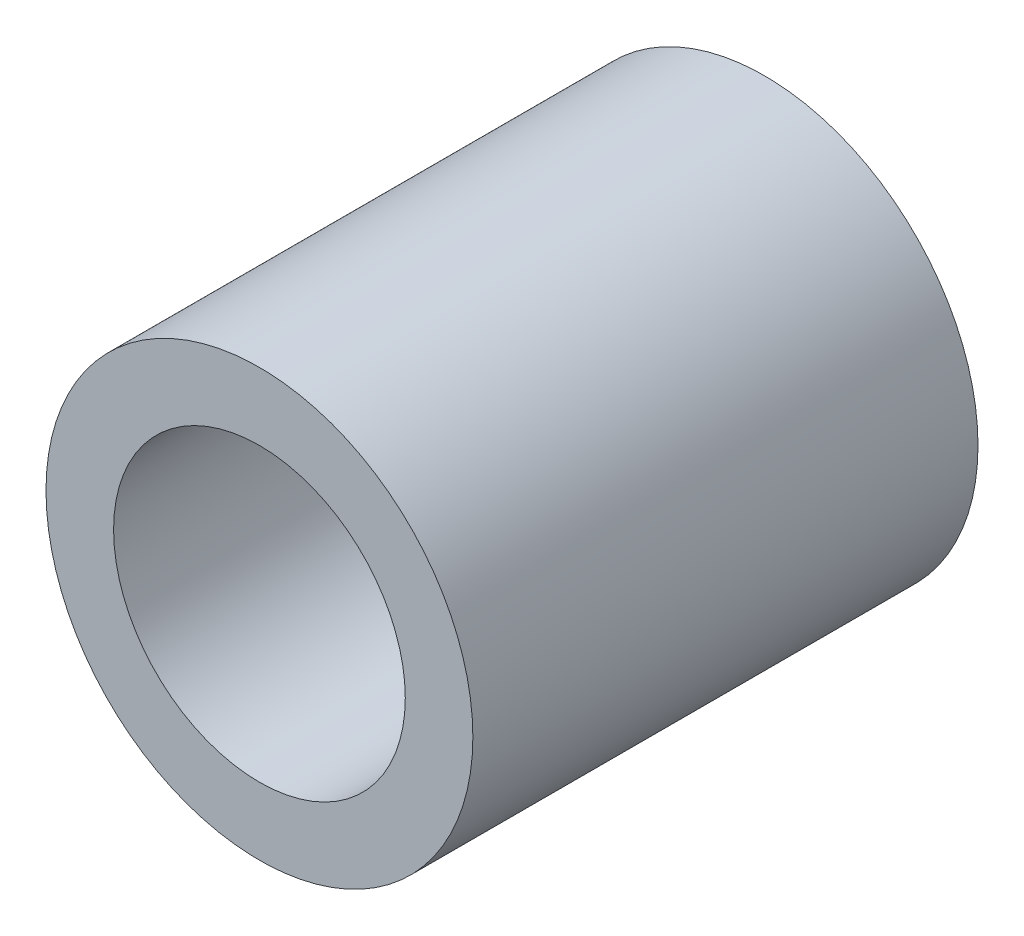
ISO-10303-21;
HEADER;
FILE_DESCRIPTION(('STEP AP214'),'2;1');
FILE_NAME('part.step','',(''),(''),'','','');
FILE_SCHEMA(('AUTOMOTIVE_DESIGN { 1 0 10303 214 1 1 1 1 }'));
ENDSEC;
DATA;
#1=APPLICATION_CONTEXT('core data for automotive mechanical design processes');
#2=APPLICATION_PROTOCOL_DEFINITION('international standard','automotive_design',2000,#1);
#3=PRODUCT_CONTEXT('',#1,'mechanical');
#4=PRODUCT('Part','Part','',(#3));
#5=PRODUCT_RELATED_PRODUCT_CATEGORY('part','',(#4));
#6=PRODUCT_DEFINITION_FORMATION('','',#4);
#7=PRODUCT_DEFINITION_CONTEXT('part definition',#1,'design');
#8=PRODUCT_DEFINITION('design','',#6,#7);
#9=PRODUCT_DEFINITION_SHAPE('','',#8);
#10=(LENGTH_UNIT() NAMED_UNIT(*) SI_UNIT(.MILLI.,.METRE.));
#11=(NAMED_UNIT(*) PLANE_ANGLE_UNIT() SI_UNIT($,.RADIAN.));
#12=(NAMED_UNIT(*) SI_UNIT($,.STERADIAN.) SOLID_ANGLE_UNIT());
#13=UNCERTAINTY_MEASURE_WITH_UNIT(LENGTH_MEASURE(1.E-05),#10,'distance_accuracy_value','');
#14=(GEOMETRIC_REPRESENTATION_CONTEXT(3) GLOBAL_UNCERTAINTY_ASSIGNED_CONTEXT((#13)) GLOBAL_UNIT_ASSIGNED_CONTEXT((#10,
#11,#12)) REPRESENTATION_CONTEXT('',''));
#15=CARTESIAN_POINT('',(0.,0.,0.));
#16=DIRECTION('',(0.,0.,1.));
#17=DIRECTION('',(1.,0.,0.));
#18=AXIS2_PLACEMENT_3D('',#15,#16,#17);
#19=CARTESIAN_POINT('',(0.,0.,7.1));
#20=DIRECTION('',(0.,0.,1.));
#21=DIRECTION('',(1.,0.,0.));
#22=AXIS2_PLACEMENT_3D('',#19,#20,#21);
#23=PLANE('',#22);
#24=CARTESIAN_POINT('',(0.,0.,7.1));
#25=DIRECTION('',(0.,0.,1.));
#26=DIRECTION('',(1.,0.,0.));
#27=AXIS2_PLACEMENT_3D('',#24,#25,#26);
#28=CIRCLE('',#27,3.);
#29=CARTESIAN_POINT('',(3.,0.,7.1));
#30=VERTEX_POINT('',#29);
#31=EDGE_CURVE('E10',#30,#30,#28,.T.);
#32=ORIENTED_EDGE('',*,*,#31,.T.);
#33=EDGE_LOOP('',(#32));
#34=FACE_BOUND('',#33,.T.);
#35=CARTESIAN_POINT('',(0.,0.,7.1));
#36=DIRECTION('',(0.,0.,1.));
#37=DIRECTION('',(1.,0.,0.));
#38=AXIS2_PLACEMENT_3D('',#35,#36,#37);
#39=CIRCLE('',#38,2.05);
#40=CARTESIAN_POINT('',(2.05,0.,7.1));
#41=VERTEX_POINT('',#40);
#42=EDGE_CURVE('E41',#41,#41,#39,.T.);
#43=ORIENTED_EDGE('',*,*,#42,.F.);
#44=EDGE_LOOP('',(#43));
#45=FACE_BOUND('',#44,.T.);
#46=ADVANCED_FACE('F30',(#34,#45),#23,.T.);
#47=CARTESIAN_POINT('',(0.,0.,0.));
#48=DIRECTION('',(0.,0.,1.));
#49=DIRECTION('',(1.,0.,0.));
#50=AXIS2_PLACEMENT_3D('',#47,#48,#49);
#51=PLANE('',#50);
#52=CARTESIAN_POINT('',(0.,0.,0.));
#53=DIRECTION('',(0.,0.,1.));
#54=DIRECTION('',(1.,0.,0.));
#55=AXIS2_PLACEMENT_3D('',#52,#53,#54);
#56=CIRCLE('',#55,3.);
#57=CARTESIAN_POINT('',(3.,0.,0.));
#58=VERTEX_POINT('',#57);
#59=EDGE_CURVE('E34',#58,#58,#56,.T.);
#60=ORIENTED_EDGE('',*,*,#59,.F.);
#61=EDGE_LOOP('',(#60));
#62=FACE_BOUND('',#61,.T.);
#63=CARTESIAN_POINT('',(0.,0.,0.));
#64=DIRECTION('',(0.,0.,1.));
#65=DIRECTION('',(1.,0.,0.));
#66=AXIS2_PLACEMENT_3D('',#63,#64,#65);
#67=CIRCLE('',#66,2.05);
#68=CARTESIAN_POINT('',(2.05,0.,0.));
#69=VERTEX_POINT('',#68);
#70=EDGE_CURVE('E43',#69,#69,#67,.T.);
#71=ORIENTED_EDGE('',*,*,#70,.T.);
#72=EDGE_LOOP('',(#71));
#73=FACE_BOUND('',#72,.T.);
#74=ADVANCED_FACE('F53',(#62,#73),#51,.F.);
#75=CARTESIAN_POINT('',(0.,0.,7.1));
#76=DIRECTION('',(0.,0.,-1.));
#77=DIRECTION('',(-1.,0.,0.));
#78=AXIS2_PLACEMENT_3D('',#75,#76,#77);
#79=CYLINDRICAL_SURFACE('',#78,3.);
#80=ORIENTED_EDGE('',*,*,#31,.F.);
#81=EDGE_LOOP('',(#80));
#82=FACE_BOUND('',#81,.T.);
#83=ORIENTED_EDGE('',*,*,#59,.T.);
#84=EDGE_LOOP('',(#83));
#85=FACE_BOUND('',#84,.T.);
#86=ADVANCED_FACE('F32',(#82,#85),#79,.T.);
#87=CARTESIAN_POINT('',(0.,0.,7.1));
#88=DIRECTION('',(0.,0.,-1.));
#89=DIRECTION('',(-1.,0.,0.));
#90=AXIS2_PLACEMENT_3D('',#87,#88,#89);
#91=CYLINDRICAL_SURFACE('',#90,2.05);
#92=ORIENTED_EDGE('',*,*,#42,.T.);
#93=EDGE_LOOP('',(#92));
#94=FACE_BOUND('',#93,.T.);
#95=ORIENTED_EDGE('',*,*,#70,.F.);
#96=EDGE_LOOP('',(#95));
#97=FACE_BOUND('',#96,.T.);
#98=ADVANCED_FACE('F49',(#94,#97),#91,.F.);
#99=CLOSED_SHELL('',(#46,#74,#86,#98));
#100=MANIFOLD_SOLID_BREP('B2',#99);
#101=ADVANCED_BREP_SHAPE_REPRESENTATION('',(#18,#100),#14);
#102=SHAPE_DEFINITION_REPRESENTATION(#9,#101);
ENDSEC;
END-ISO-10303-21;
